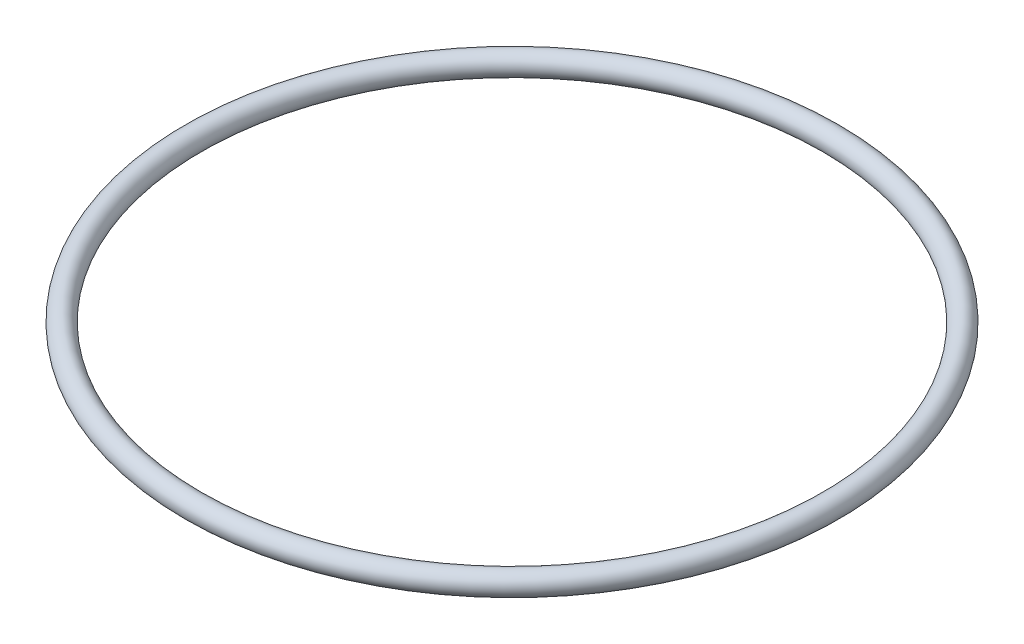
ISO-10303-21;
HEADER;
FILE_DESCRIPTION(('STEP AP214'),'2;1');
FILE_NAME('part.step','',(''),(''),'','','');
FILE_SCHEMA(('AUTOMOTIVE_DESIGN { 1 0 10303 214 1 1 1 1 }'));
ENDSEC;
DATA;
#1=APPLICATION_CONTEXT('core data for automotive mechanical design processes');
#2=APPLICATION_PROTOCOL_DEFINITION('international standard','automotive_design',2000,#1);
#3=PRODUCT_CONTEXT('',#1,'mechanical');
#4=PRODUCT('Part','Part','',(#3));
#5=PRODUCT_RELATED_PRODUCT_CATEGORY('part','',(#4));
#6=PRODUCT_DEFINITION_FORMATION('','',#4);
#7=PRODUCT_DEFINITION_CONTEXT('part definition',#1,'design');
#8=PRODUCT_DEFINITION('design','',#6,#7);
#9=PRODUCT_DEFINITION_SHAPE('','',#8);
#10=(LENGTH_UNIT() NAMED_UNIT(*) SI_UNIT(.MILLI.,.METRE.));
#11=(NAMED_UNIT(*) PLANE_ANGLE_UNIT() SI_UNIT($,.RADIAN.));
#12=(NAMED_UNIT(*) SI_UNIT($,.STERADIAN.) SOLID_ANGLE_UNIT());
#13=UNCERTAINTY_MEASURE_WITH_UNIT(LENGTH_MEASURE(1.E-05),#10,'distance_accuracy_value','');
#14=(GEOMETRIC_REPRESENTATION_CONTEXT(3) GLOBAL_UNCERTAINTY_ASSIGNED_CONTEXT((#13)) GLOBAL_UNIT_ASSIGNED_CONTEXT((#10,
#11,#12)) REPRESENTATION_CONTEXT('',''));
#15=CARTESIAN_POINT('',(0.,0.,0.));
#16=DIRECTION('',(0.,0.,1.));
#17=DIRECTION('',(1.,0.,0.));
#18=AXIS2_PLACEMENT_3D('',#15,#16,#17);
#19=CARTESIAN_POINT('',(0.,0.,0.));
#20=DIRECTION('',(0.,-1.,0.));
#21=DIRECTION('',(0.,0.,-1.));
#22=AXIS2_PLACEMENT_3D('',#19,#20,#21);
#23=TOROIDAL_SURFACE('',#22,50.775,1.76500000000001);
#24=CARTESIAN_POINT('',(0.,0.,-52.54));
#25=VERTEX_POINT('',#24);
#26=VERTEX_LOOP('',#25);
#27=FACE_BOUND('',#26,.T.);
#28=ADVANCED_FACE('F28',(#27),#23,.T.);
#29=CLOSED_SHELL('',(#28));
#30=MANIFOLD_SOLID_BREP('B2',#29);
#31=ADVANCED_BREP_SHAPE_REPRESENTATION('',(#18,#30),#14);
#32=SHAPE_DEFINITION_REPRESENTATION(#9,#31);
ENDSEC;
END-ISO-10303-21;
